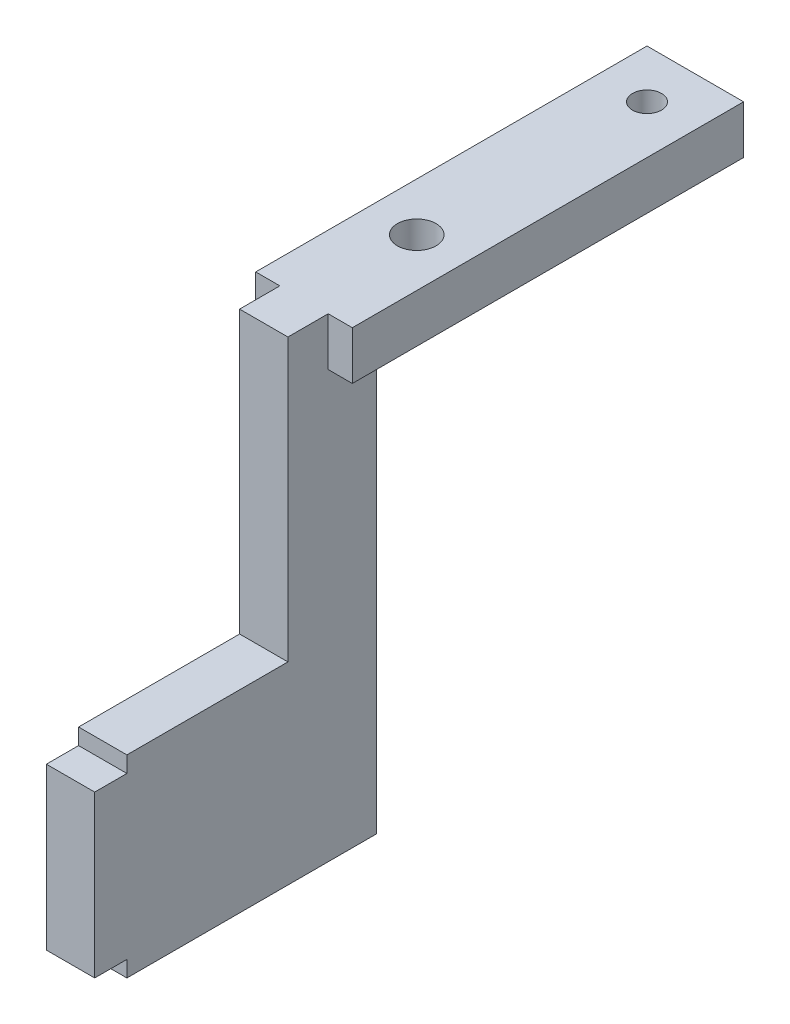
ISO-10303-21;
HEADER;
FILE_DESCRIPTION(('STEP AP214'),'2;1');
FILE_NAME('part.step','',(''),(''),'','','');
FILE_SCHEMA(('AUTOMOTIVE_DESIGN { 1 0 10303 214 1 1 1 1 }'));
ENDSEC;
DATA;
#1=APPLICATION_CONTEXT('core data for automotive mechanical design processes');
#2=APPLICATION_PROTOCOL_DEFINITION('international standard','automotive_design',2000,#1);
#3=PRODUCT_CONTEXT('',#1,'mechanical');
#4=PRODUCT('Part','Part','',(#3));
#5=PRODUCT_RELATED_PRODUCT_CATEGORY('part','',(#4));
#6=PRODUCT_DEFINITION_FORMATION('','',#4);
#7=PRODUCT_DEFINITION_CONTEXT('part definition',#1,'design');
#8=PRODUCT_DEFINITION('design','',#6,#7);
#9=PRODUCT_DEFINITION_SHAPE('','',#8);
#10=(LENGTH_UNIT() NAMED_UNIT(*) SI_UNIT(.MILLI.,.METRE.));
#11=(NAMED_UNIT(*) PLANE_ANGLE_UNIT() SI_UNIT($,.RADIAN.));
#12=(NAMED_UNIT(*) SI_UNIT($,.STERADIAN.) SOLID_ANGLE_UNIT());
#13=UNCERTAINTY_MEASURE_WITH_UNIT(LENGTH_MEASURE(1.E-05),#10,'distance_accuracy_value','');
#14=(GEOMETRIC_REPRESENTATION_CONTEXT(3) GLOBAL_UNCERTAINTY_ASSIGNED_CONTEXT((#13)) GLOBAL_UNIT_ASSIGNED_CONTEXT((#10,
#11,#12)) REPRESENTATION_CONTEXT('',''));
#15=CARTESIAN_POINT('',(0.,0.,0.));
#16=DIRECTION('',(0.,0.,1.));
#17=DIRECTION('',(1.,0.,0.));
#18=AXIS2_PLACEMENT_3D('',#15,#16,#17);
#19=CARTESIAN_POINT('',(16.3,23.475,46.));
#20=DIRECTION('',(1.,0.,0.));
#21=DIRECTION('',(0.,0.,-1.));
#22=AXIS2_PLACEMENT_3D('',#19,#20,#21);
#23=PLANE('',#22);
#24=DIRECTION('',(0.,-1.,0.));
#25=VECTOR('',#24,1.);
#26=CARTESIAN_POINT('',(16.3,23.475,44.));
#27=LINE('',#26,#25);
#28=CARTESIAN_POINT('',(16.3,-5.,44.));
#29=VERTEX_POINT('',#28);
#30=CARTESIAN_POINT('',(16.3,-6.,44.));
#31=VERTEX_POINT('',#30);
#32=EDGE_CURVE('E53',#29,#31,#27,.T.);
#33=ORIENTED_EDGE('',*,*,#32,.F.);
#34=DIRECTION('',(0.,0.,-1.));
#35=VECTOR('',#34,1.);
#36=CARTESIAN_POINT('',(16.3,-5.,46.));
#37=LINE('',#36,#35);
#38=CARTESIAN_POINT('',(16.3,-5.,46.));
#39=VERTEX_POINT('',#38);
#40=EDGE_CURVE('E183',#39,#29,#37,.T.);
#41=ORIENTED_EDGE('',*,*,#40,.F.);
#42=DIRECTION('',(0.,-1.,0.));
#43=VECTOR('',#42,1.);
#44=CARTESIAN_POINT('',(16.3,23.475,46.));
#45=LINE('',#44,#43);
#46=CARTESIAN_POINT('',(16.3,5.,46.));
#47=VERTEX_POINT('',#46);
#48=EDGE_CURVE('E208',#47,#39,#45,.T.);
#49=ORIENTED_EDGE('',*,*,#48,.F.);
#50=DIRECTION('',(0.,0.,1.));
#51=VECTOR('',#50,1.);
#52=CARTESIAN_POINT('',(16.3,5.,46.));
#53=LINE('',#52,#51);
#54=CARTESIAN_POINT('',(16.3,5.,44.));
#55=VERTEX_POINT('',#54);
#56=EDGE_CURVE('E162',#55,#47,#53,.T.);
#57=ORIENTED_EDGE('',*,*,#56,.F.);
#58=DIRECTION('',(0.,-1.,0.));
#59=VECTOR('',#58,1.);
#60=CARTESIAN_POINT('',(16.3,23.475,44.));
#61=LINE('',#60,#59);
#62=CARTESIAN_POINT('',(16.3,6.,44.));
#63=VERTEX_POINT('',#62);
#64=EDGE_CURVE('E168',#63,#55,#61,.T.);
#65=ORIENTED_EDGE('',*,*,#64,.F.);
#66=DIRECTION('',(0.,0.,1.));
#67=VECTOR('',#66,1.);
#68=CARTESIAN_POINT('',(16.3,6.,46.));
#69=LINE('',#68,#67);
#70=CARTESIAN_POINT('',(16.3,6.,34.));
#71=VERTEX_POINT('',#70);
#72=EDGE_CURVE('E188',#71,#63,#69,.T.);
#73=ORIENTED_EDGE('',*,*,#72,.F.);
#74=DIRECTION('',(0.,-1.,0.));
#75=VECTOR('',#74,1.);
#76=CARTESIAN_POINT('',(16.3,23.475,34.));
#77=LINE('',#76,#75);
#78=CARTESIAN_POINT('',(16.3,23.475,34.));
#79=VERTEX_POINT('',#78);
#80=EDGE_CURVE('E195',#79,#71,#77,.T.);
#81=ORIENTED_EDGE('',*,*,#80,.F.);
#82=DIRECTION('',(0.,0.,-1.));
#83=VECTOR('',#82,1.);
#84=CARTESIAN_POINT('',(16.3,23.475,46.));
#85=LINE('',#84,#83);
#86=CARTESIAN_POINT('',(16.3,23.475,31.5));
#87=VERTEX_POINT('',#86);
#88=EDGE_CURVE('E217',#79,#87,#85,.T.);
#89=ORIENTED_EDGE('',*,*,#88,.T.);
#90=DIRECTION('',(0.,1.,0.));
#91=VECTOR('',#90,1.);
#92=CARTESIAN_POINT('',(16.3,0.,31.5));
#93=LINE('',#92,#91);
#94=CARTESIAN_POINT('',(16.3,20.475,31.5));
#95=VERTEX_POINT('',#94);
#96=EDGE_CURVE('E274',#95,#87,#93,.T.);
#97=ORIENTED_EDGE('',*,*,#96,.F.);
#98=DIRECTION('',(0.,0.,-1.));
#99=VECTOR('',#98,1.);
#100=CARTESIAN_POINT('',(16.3,20.475,31.5));
#101=LINE('',#100,#99);
#102=CARTESIAN_POINT('',(16.3,20.475,28.5));
#103=VERTEX_POINT('',#102);
#104=EDGE_CURVE('E231',#95,#103,#101,.T.);
#105=ORIENTED_EDGE('',*,*,#104,.T.);
#106=DIRECTION('',(0.,-1.,0.));
#107=VECTOR('',#106,1.);
#108=CARTESIAN_POINT('',(16.3,23.475,28.5));
#109=LINE('',#108,#107);
#110=CARTESIAN_POINT('',(16.3,-6.,28.5));
#111=VERTEX_POINT('',#110);
#112=EDGE_CURVE('E209',#103,#111,#109,.T.);
#113=ORIENTED_EDGE('',*,*,#112,.T.);
#114=DIRECTION('',(0.,0.,-1.));
#115=VECTOR('',#114,1.);
#116=CARTESIAN_POINT('',(16.3,-6.,46.));
#117=LINE('',#116,#115);
#118=EDGE_CURVE('E230',#31,#111,#117,.T.);
#119=ORIENTED_EDGE('',*,*,#118,.F.);
#120=EDGE_LOOP('',(#33,#41,#49,#57,#65,#73,#81,#89,#97,#105,#113,#119));
#121=FACE_BOUND('',#120,.T.);
#122=ADVANCED_FACE('F39',(#121),#23,.F.);
#123=CARTESIAN_POINT('',(19.3,-6.,46.));
#124=DIRECTION('',(-1.,0.,0.));
#125=DIRECTION('',(0.,0.,1.));
#126=AXIS2_PLACEMENT_3D('',#123,#124,#125);
#127=PLANE('',#126);
#128=DIRECTION('',(0.,1.,0.));
#129=VECTOR('',#128,1.);
#130=CARTESIAN_POINT('',(19.3,-6.,44.));
#131=LINE('',#130,#129);
#132=CARTESIAN_POINT('',(19.3,-6.,44.));
#133=VERTEX_POINT('',#132);
#134=CARTESIAN_POINT('',(19.3,-5.,44.));
#135=VERTEX_POINT('',#134);
#136=EDGE_CURVE('E174',#133,#135,#131,.T.);
#137=ORIENTED_EDGE('',*,*,#136,.F.);
#138=DIRECTION('',(0.,0.,-1.));
#139=VECTOR('',#138,1.);
#140=CARTESIAN_POINT('',(19.3,-6.,46.));
#141=LINE('',#140,#139);
#142=CARTESIAN_POINT('',(19.3,-6.,28.5));
#143=VERTEX_POINT('',#142);
#144=EDGE_CURVE('E227',#133,#143,#141,.T.);
#145=ORIENTED_EDGE('',*,*,#144,.T.);
#146=DIRECTION('',(0.,1.,0.));
#147=VECTOR('',#146,1.);
#148=CARTESIAN_POINT('',(19.3,-6.,28.5));
#149=LINE('',#148,#147);
#150=CARTESIAN_POINT('',(19.3,20.475,28.5));
#151=VERTEX_POINT('',#150);
#152=EDGE_CURVE('E213',#143,#151,#149,.T.);
#153=ORIENTED_EDGE('',*,*,#152,.T.);
#154=DIRECTION('',(0.,0.,1.));
#155=VECTOR('',#154,1.);
#156=CARTESIAN_POINT('',(19.3,20.475,31.5));
#157=LINE('',#156,#155);
#158=CARTESIAN_POINT('',(19.3,20.475,31.5));
#159=VERTEX_POINT('',#158);
#160=EDGE_CURVE('E233',#151,#159,#157,.T.);
#161=ORIENTED_EDGE('',*,*,#160,.T.);
#162=DIRECTION('',(0.,-1.,0.));
#163=VECTOR('',#162,1.);
#164=CARTESIAN_POINT('',(19.3,0.,31.5));
#165=LINE('',#164,#163);
#166=CARTESIAN_POINT('',(19.3,23.475,31.5));
#167=VERTEX_POINT('',#166);
#168=EDGE_CURVE('E272',#167,#159,#165,.T.);
#169=ORIENTED_EDGE('',*,*,#168,.F.);
#170=DIRECTION('',(0.,0.,-1.));
#171=VECTOR('',#170,1.);
#172=CARTESIAN_POINT('',(19.3,23.475,46.));
#173=LINE('',#172,#171);
#174=CARTESIAN_POINT('',(19.3,23.475,34.));
#175=VERTEX_POINT('',#174);
#176=EDGE_CURVE('E221',#175,#167,#173,.T.);
#177=ORIENTED_EDGE('',*,*,#176,.F.);
#178=DIRECTION('',(0.,1.,0.));
#179=VECTOR('',#178,1.);
#180=CARTESIAN_POINT('',(19.3,-6.,34.));
#181=LINE('',#180,#179);
#182=CARTESIAN_POINT('',(19.3,6.,34.));
#183=VERTEX_POINT('',#182);
#184=EDGE_CURVE('E277',#183,#175,#181,.T.);
#185=ORIENTED_EDGE('',*,*,#184,.F.);
#186=DIRECTION('',(0.,0.,-1.));
#187=VECTOR('',#186,1.);
#188=CARTESIAN_POINT('',(19.3,6.,46.));
#189=LINE('',#188,#187);
#190=CARTESIAN_POINT('',(19.3,6.,44.));
#191=VERTEX_POINT('',#190);
#192=EDGE_CURVE('E173',#191,#183,#189,.T.);
#193=ORIENTED_EDGE('',*,*,#192,.F.);
#194=DIRECTION('',(0.,1.,0.));
#195=VECTOR('',#194,1.);
#196=CARTESIAN_POINT('',(19.3,-6.,44.));
#197=LINE('',#196,#195);
#198=CARTESIAN_POINT('',(19.3,5.,44.));
#199=VERTEX_POINT('',#198);
#200=EDGE_CURVE('E62',#199,#191,#197,.T.);
#201=ORIENTED_EDGE('',*,*,#200,.F.);
#202=DIRECTION('',(0.,0.,-1.));
#203=VECTOR('',#202,1.);
#204=CARTESIAN_POINT('',(19.3,5.,46.));
#205=LINE('',#204,#203);
#206=CARTESIAN_POINT('',(19.3,5.,46.));
#207=VERTEX_POINT('',#206);
#208=EDGE_CURVE('E151',#207,#199,#205,.T.);
#209=ORIENTED_EDGE('',*,*,#208,.F.);
#210=DIRECTION('',(0.,1.,0.));
#211=VECTOR('',#210,1.);
#212=CARTESIAN_POINT('',(19.3,-6.,46.));
#213=LINE('',#212,#211);
#214=CARTESIAN_POINT('',(19.3,-5.,46.));
#215=VERTEX_POINT('',#214);
#216=EDGE_CURVE('E214',#215,#207,#213,.T.);
#217=ORIENTED_EDGE('',*,*,#216,.F.);
#218=DIRECTION('',(0.,0.,1.));
#219=VECTOR('',#218,1.);
#220=CARTESIAN_POINT('',(19.3,-5.,46.));
#221=LINE('',#220,#219);
#222=EDGE_CURVE('E185',#135,#215,#221,.T.);
#223=ORIENTED_EDGE('',*,*,#222,.F.);
#224=EDGE_LOOP('',(#137,#145,#153,#161,#169,#177,#185,#193,#201,#209,#217,#223));
#225=FACE_BOUND('',#224,.T.);
#226=ADVANCED_FACE('F171',(#225),#127,.F.);
#227=CARTESIAN_POINT('',(0.,0.,46.));
#228=DIRECTION('',(0.,0.,1.));
#229=DIRECTION('',(1.,0.,0.));
#230=AXIS2_PLACEMENT_3D('',#227,#228,#229);
#231=PLANE('',#230);
#232=ORIENTED_EDGE('',*,*,#48,.T.);
#233=DIRECTION('',(1.,0.,0.));
#234=VECTOR('',#233,1.);
#235=CARTESIAN_POINT('',(0.,-5.,46.));
#236=LINE('',#235,#234);
#237=EDGE_CURVE('E11',#39,#215,#236,.T.);
#238=ORIENTED_EDGE('',*,*,#237,.T.);
#239=ORIENTED_EDGE('',*,*,#216,.T.);
#240=DIRECTION('',(-1.,0.,0.));
#241=VECTOR('',#240,1.);
#242=CARTESIAN_POINT('',(0.,5.,46.));
#243=LINE('',#242,#241);
#244=EDGE_CURVE('E50',#207,#47,#243,.T.);
#245=ORIENTED_EDGE('',*,*,#244,.T.);
#246=EDGE_LOOP('',(#232,#238,#239,#245));
#247=FACE_BOUND('',#246,.T.);
#248=ADVANCED_FACE('F281',(#247),#231,.T.);
#249=CARTESIAN_POINT('',(16.3,-6.,46.));
#250=DIRECTION('',(0.,1.,0.));
#251=DIRECTION('',(0.,0.,1.));
#252=AXIS2_PLACEMENT_3D('',#249,#250,#251);
#253=PLANE('',#252);
#254=DIRECTION('',(1.,0.,0.));
#255=VECTOR('',#254,1.);
#256=CARTESIAN_POINT('',(16.3,-6.,44.));
#257=LINE('',#256,#255);
#258=EDGE_CURVE('E282',#31,#133,#257,.T.);
#259=ORIENTED_EDGE('',*,*,#258,.F.);
#260=ORIENTED_EDGE('',*,*,#118,.T.);
#261=DIRECTION('',(1.,0.,0.));
#262=VECTOR('',#261,1.);
#263=CARTESIAN_POINT('',(16.3,-6.,28.5));
#264=LINE('',#263,#262);
#265=EDGE_CURVE('E216',#111,#143,#264,.T.);
#266=ORIENTED_EDGE('',*,*,#265,.T.);
#267=ORIENTED_EDGE('',*,*,#144,.F.);
#268=EDGE_LOOP('',(#259,#260,#266,#267));
#269=FACE_BOUND('',#268,.T.);
#270=ADVANCED_FACE('F294',(#269),#253,.F.);
#271=CARTESIAN_POINT('',(14.8,6.,47.));
#272=DIRECTION('',(0.,1.,0.));
#273=DIRECTION('',(0.,0.,1.));
#274=AXIS2_PLACEMENT_3D('',#271,#272,#273);
#275=PLANE('',#274);
#276=ORIENTED_EDGE('',*,*,#72,.T.);
#277=DIRECTION('',(1.,0.,0.));
#278=VECTOR('',#277,1.);
#279=CARTESIAN_POINT('',(14.8,6.,44.));
#280=LINE('',#279,#278);
#281=EDGE_CURVE('E278',#63,#191,#280,.T.);
#282=ORIENTED_EDGE('',*,*,#281,.T.);
#283=ORIENTED_EDGE('',*,*,#192,.T.);
#284=DIRECTION('',(-1.,0.,0.));
#285=VECTOR('',#284,1.);
#286=CARTESIAN_POINT('',(14.8,6.,34.));
#287=LINE('',#286,#285);
#288=EDGE_CURVE('E187',#183,#71,#287,.T.);
#289=ORIENTED_EDGE('',*,*,#288,.T.);
#290=EDGE_LOOP('',(#276,#282,#283,#289));
#291=FACE_BOUND('',#290,.T.);
#292=ADVANCED_FACE('F327',(#291),#275,.T.);
#293=CARTESIAN_POINT('',(20.8,23.475,31.5));
#294=DIRECTION('',(0.,-1.,0.));
#295=DIRECTION('',(0.,0.,-1.));
#296=AXIS2_PLACEMENT_3D('',#293,#294,#295);
#297=PLANE('',#296);
#298=CARTESIAN_POINT('',(17.8,23.475,10.2));
#299=DIRECTION('',(0.,1.,0.));
#300=DIRECTION('',(0.,0.,1.));
#301=AXIS2_PLACEMENT_3D('',#298,#299,#300);
#302=CIRCLE('',#301,0.900000000000001);
#303=CARTESIAN_POINT('',(17.8,23.475,11.1));
#304=VERTEX_POINT('',#303);
#305=EDGE_CURVE('E199',#304,#304,#302,.T.);
#306=ORIENTED_EDGE('',*,*,#305,.F.);
#307=EDGE_LOOP('',(#306));
#308=FACE_BOUND('',#307,.T.);
#309=CARTESIAN_POINT('',(17.8,23.475,24.5));
#310=DIRECTION('',(0.,1.,0.));
#311=DIRECTION('',(0.,0.,1.));
#312=AXIS2_PLACEMENT_3D('',#309,#310,#311);
#313=CIRCLE('',#312,1.2);
#314=CARTESIAN_POINT('',(17.8,23.475,25.7));
#315=VERTEX_POINT('',#314);
#316=EDGE_CURVE('E200',#315,#315,#313,.T.);
#317=ORIENTED_EDGE('',*,*,#316,.F.);
#318=EDGE_LOOP('',(#317));
#319=FACE_BOUND('',#318,.T.);
#320=DIRECTION('',(-1.,0.,0.));
#321=VECTOR('',#320,1.);
#322=CARTESIAN_POINT('',(20.8,23.475,34.));
#323=LINE('',#322,#321);
#324=EDGE_CURVE('E194',#175,#79,#323,.T.);
#325=ORIENTED_EDGE('',*,*,#324,.F.);
#326=ORIENTED_EDGE('',*,*,#176,.T.);
#327=DIRECTION('',(-1.,0.,0.));
#328=VECTOR('',#327,1.);
#329=CARTESIAN_POINT('',(20.8,23.475,31.5));
#330=LINE('',#329,#328);
#331=CARTESIAN_POINT('',(20.8,23.475,31.5));
#332=VERTEX_POINT('',#331);
#333=EDGE_CURVE('E248',#332,#167,#330,.T.);
#334=ORIENTED_EDGE('',*,*,#333,.F.);
#335=DIRECTION('',(0.,0.,-1.));
#336=VECTOR('',#335,1.);
#337=CARTESIAN_POINT('',(20.8,23.475,31.5));
#338=LINE('',#337,#336);
#339=CARTESIAN_POINT('',(20.8,23.475,7.2));
#340=VERTEX_POINT('',#339);
#341=EDGE_CURVE('E264',#332,#340,#338,.T.);
#342=ORIENTED_EDGE('',*,*,#341,.T.);
#343=DIRECTION('',(-1.,0.,0.));
#344=VECTOR('',#343,1.);
#345=CARTESIAN_POINT('',(20.8,23.475,7.2));
#346=LINE('',#345,#344);
#347=CARTESIAN_POINT('',(14.8,23.475,7.2));
#348=VERTEX_POINT('',#347);
#349=EDGE_CURVE('E245',#340,#348,#346,.T.);
#350=ORIENTED_EDGE('',*,*,#349,.T.);
#351=DIRECTION('',(0.,0.,-1.));
#352=VECTOR('',#351,1.);
#353=CARTESIAN_POINT('',(14.8,23.475,31.5));
#354=LINE('',#353,#352);
#355=CARTESIAN_POINT('',(14.8,23.475,31.5));
#356=VERTEX_POINT('',#355);
#357=EDGE_CURVE('E255',#356,#348,#354,.T.);
#358=ORIENTED_EDGE('',*,*,#357,.F.);
#359=EDGE_CURVE('E247',#87,#356,#330,.T.);
#360=ORIENTED_EDGE('',*,*,#359,.F.);
#361=ORIENTED_EDGE('',*,*,#88,.F.);
#362=EDGE_LOOP('',(#325,#326,#334,#342,#350,#358,#360,#361));
#363=FACE_BOUND('',#362,.T.);
#364=ADVANCED_FACE('F320',(#308,#319,#363),#297,.F.);
#365=CARTESIAN_POINT('',(14.8,20.475,31.5));
#366=DIRECTION('',(0.,1.,0.));
#367=DIRECTION('',(0.,0.,1.));
#368=AXIS2_PLACEMENT_3D('',#365,#366,#367);
#369=PLANE('',#368);
#370=CARTESIAN_POINT('',(17.8,20.475,24.5));
#371=DIRECTION('',(0.,1.,0.));
#372=DIRECTION('',(0.,0.,1.));
#373=AXIS2_PLACEMENT_3D('',#370,#371,#372);
#374=CIRCLE('',#373,1.2);
#375=CARTESIAN_POINT('',(17.8,20.475,25.7));
#376=VERTEX_POINT('',#375);
#377=EDGE_CURVE('E207',#376,#376,#374,.T.);
#378=ORIENTED_EDGE('',*,*,#377,.T.);
#379=EDGE_LOOP('',(#378));
#380=FACE_BOUND('',#379,.T.);
#381=CARTESIAN_POINT('',(17.8,20.475,10.2));
#382=DIRECTION('',(0.,1.,0.));
#383=DIRECTION('',(0.,0.,1.));
#384=AXIS2_PLACEMENT_3D('',#381,#382,#383);
#385=CIRCLE('',#384,0.900000000000001);
#386=CARTESIAN_POINT('',(17.8,20.475,11.1));
#387=VERTEX_POINT('',#386);
#388=EDGE_CURVE('E202',#387,#387,#385,.T.);
#389=ORIENTED_EDGE('',*,*,#388,.T.);
#390=EDGE_LOOP('',(#389));
#391=FACE_BOUND('',#390,.T.);
#392=ORIENTED_EDGE('',*,*,#104,.F.);
#393=DIRECTION('',(1.,0.,0.));
#394=VECTOR('',#393,1.);
#395=CARTESIAN_POINT('',(14.8,20.475,31.5));
#396=LINE('',#395,#394);
#397=CARTESIAN_POINT('',(14.8,20.475,31.5));
#398=VERTEX_POINT('',#397);
#399=EDGE_CURVE('E243',#398,#95,#396,.T.);
#400=ORIENTED_EDGE('',*,*,#399,.F.);
#401=DIRECTION('',(0.,0.,-1.));
#402=VECTOR('',#401,1.);
#403=CARTESIAN_POINT('',(14.8,20.475,31.5));
#404=LINE('',#403,#402);
#405=CARTESIAN_POINT('',(14.8,20.475,7.2));
#406=VERTEX_POINT('',#405);
#407=EDGE_CURVE('E268',#398,#406,#404,.T.);
#408=ORIENTED_EDGE('',*,*,#407,.T.);
#409=DIRECTION('',(1.,0.,0.));
#410=VECTOR('',#409,1.);
#411=CARTESIAN_POINT('',(14.8,20.475,7.2));
#412=LINE('',#411,#410);
#413=CARTESIAN_POINT('',(20.8,20.475,7.2));
#414=VERTEX_POINT('',#413);
#415=EDGE_CURVE('E253',#406,#414,#412,.T.);
#416=ORIENTED_EDGE('',*,*,#415,.T.);
#417=DIRECTION('',(0.,0.,-1.));
#418=VECTOR('',#417,1.);
#419=CARTESIAN_POINT('',(20.8,20.475,31.5));
#420=LINE('',#419,#418);
#421=CARTESIAN_POINT('',(20.8,20.475,31.5));
#422=VERTEX_POINT('',#421);
#423=EDGE_CURVE('E263',#422,#414,#420,.T.);
#424=ORIENTED_EDGE('',*,*,#423,.F.);
#425=EDGE_CURVE('E241',#159,#422,#396,.T.);
#426=ORIENTED_EDGE('',*,*,#425,.F.);
#427=ORIENTED_EDGE('',*,*,#160,.F.);
#428=DIRECTION('',(1.,0.,0.));
#429=VECTOR('',#428,1.);
#430=CARTESIAN_POINT('',(14.8,20.475,28.5));
#431=LINE('',#430,#429);
#432=EDGE_CURVE('E232',#103,#151,#431,.T.);
#433=ORIENTED_EDGE('',*,*,#432,.F.);
#434=EDGE_LOOP('',(#392,#400,#408,#416,#424,#426,#427,#433));
#435=FACE_BOUND('',#434,.T.);
#436=ADVANCED_FACE('F310',(#380,#391,#435),#369,.F.);
#437=CARTESIAN_POINT('',(0.,0.,31.5));
#438=DIRECTION('',(0.,0.,1.));
#439=DIRECTION('',(1.,0.,0.));
#440=AXIS2_PLACEMENT_3D('',#437,#438,#439);
#441=PLANE('',#440);
#442=ORIENTED_EDGE('',*,*,#399,.T.);
#443=ORIENTED_EDGE('',*,*,#96,.T.);
#444=ORIENTED_EDGE('',*,*,#359,.T.);
#445=DIRECTION('',(0.,-1.,0.));
#446=VECTOR('',#445,1.);
#447=CARTESIAN_POINT('',(14.8,23.475,31.5));
#448=LINE('',#447,#446);
#449=EDGE_CURVE('E238',#356,#398,#448,.T.);
#450=ORIENTED_EDGE('',*,*,#449,.T.);
#451=EDGE_LOOP('',(#442,#443,#444,#450));
#452=FACE_BOUND('',#451,.T.);
#453=ADVANCED_FACE('F349',(#452),#441,.T.);
#454=ORIENTED_EDGE('',*,*,#333,.T.);
#455=ORIENTED_EDGE('',*,*,#168,.T.);
#456=ORIENTED_EDGE('',*,*,#425,.T.);
#457=DIRECTION('',(0.,1.,0.));
#458=VECTOR('',#457,1.);
#459=CARTESIAN_POINT('',(20.8,20.475,31.5));
#460=LINE('',#459,#458);
#461=EDGE_CURVE('E246',#422,#332,#460,.T.);
#462=ORIENTED_EDGE('',*,*,#461,.T.);
#463=EDGE_LOOP('',(#454,#455,#456,#462));
#464=FACE_BOUND('',#463,.T.);
#465=ADVANCED_FACE('F311',(#464),#441,.T.);
#466=CARTESIAN_POINT('',(14.8,23.475,31.5));
#467=DIRECTION('',(1.,0.,0.));
#468=DIRECTION('',(0.,0.,-1.));
#469=AXIS2_PLACEMENT_3D('',#466,#467,#468);
#470=PLANE('',#469);
#471=DIRECTION('',(0.,-1.,0.));
#472=VECTOR('',#471,1.);
#473=CARTESIAN_POINT('',(14.8,23.475,7.2));
#474=LINE('',#473,#472);
#475=EDGE_CURVE('E240',#348,#406,#474,.T.);
#476=ORIENTED_EDGE('',*,*,#475,.T.);
#477=ORIENTED_EDGE('',*,*,#407,.F.);
#478=ORIENTED_EDGE('',*,*,#449,.F.);
#479=ORIENTED_EDGE('',*,*,#357,.T.);
#480=EDGE_LOOP('',(#476,#477,#478,#479));
#481=FACE_BOUND('',#480,.T.);
#482=ADVANCED_FACE('F41',(#481),#470,.F.);
#483=CARTESIAN_POINT('',(20.8,20.475,31.5));
#484=DIRECTION('',(-1.,0.,0.));
#485=DIRECTION('',(0.,0.,1.));
#486=AXIS2_PLACEMENT_3D('',#483,#484,#485);
#487=PLANE('',#486);
#488=DIRECTION('',(0.,1.,0.));
#489=VECTOR('',#488,1.);
#490=CARTESIAN_POINT('',(20.8,20.475,7.2));
#491=LINE('',#490,#489);
#492=EDGE_CURVE('E257',#414,#340,#491,.T.);
#493=ORIENTED_EDGE('',*,*,#492,.T.);
#494=ORIENTED_EDGE('',*,*,#341,.F.);
#495=ORIENTED_EDGE('',*,*,#461,.F.);
#496=ORIENTED_EDGE('',*,*,#423,.T.);
#497=EDGE_LOOP('',(#493,#494,#495,#496));
#498=FACE_BOUND('',#497,.T.);
#499=ADVANCED_FACE('F353',(#498),#487,.F.);
#500=CARTESIAN_POINT('',(0.,0.,7.2));
#501=DIRECTION('',(0.,0.,1.));
#502=DIRECTION('',(1.,0.,0.));
#503=AXIS2_PLACEMENT_3D('',#500,#501,#502);
#504=PLANE('',#503);
#505=ORIENTED_EDGE('',*,*,#475,.F.);
#506=ORIENTED_EDGE('',*,*,#349,.F.);
#507=ORIENTED_EDGE('',*,*,#492,.F.);
#508=ORIENTED_EDGE('',*,*,#415,.F.);
#509=EDGE_LOOP('',(#505,#506,#507,#508));
#510=FACE_BOUND('',#509,.T.);
#511=ADVANCED_FACE('F352',(#510),#504,.F.);
#512=CARTESIAN_POINT('',(0.,0.,28.5));
#513=DIRECTION('',(0.,0.,1.));
#514=DIRECTION('',(1.,0.,0.));
#515=AXIS2_PLACEMENT_3D('',#512,#513,#514);
#516=PLANE('',#515);
#517=ORIENTED_EDGE('',*,*,#112,.F.);
#518=ORIENTED_EDGE('',*,*,#432,.T.);
#519=ORIENTED_EDGE('',*,*,#152,.F.);
#520=ORIENTED_EDGE('',*,*,#265,.F.);
#521=EDGE_LOOP('',(#517,#518,#519,#520));
#522=FACE_BOUND('',#521,.T.);
#523=ADVANCED_FACE('F297',(#522),#516,.F.);
#524=CARTESIAN_POINT('',(17.8,-6.,10.2));
#525=DIRECTION('',(0.,1.,0.));
#526=DIRECTION('',(0.,0.,1.));
#527=AXIS2_PLACEMENT_3D('',#524,#525,#526);
#528=CYLINDRICAL_SURFACE('',#527,0.900000000000001);
#529=ORIENTED_EDGE('',*,*,#305,.T.);
#530=EDGE_LOOP('',(#529));
#531=FACE_BOUND('',#530,.T.);
#532=ORIENTED_EDGE('',*,*,#388,.F.);
#533=EDGE_LOOP('',(#532));
#534=FACE_BOUND('',#533,.T.);
#535=ADVANCED_FACE('F368',(#531,#534),#528,.F.);
#536=CARTESIAN_POINT('',(17.8,-6.,24.5));
#537=DIRECTION('',(0.,1.,0.));
#538=DIRECTION('',(0.,0.,1.));
#539=AXIS2_PLACEMENT_3D('',#536,#537,#538);
#540=CYLINDRICAL_SURFACE('',#539,1.2);
#541=ORIENTED_EDGE('',*,*,#316,.T.);
#542=EDGE_LOOP('',(#541));
#543=FACE_BOUND('',#542,.T.);
#544=ORIENTED_EDGE('',*,*,#377,.F.);
#545=EDGE_LOOP('',(#544));
#546=FACE_BOUND('',#545,.T.);
#547=ADVANCED_FACE('F367',(#543,#546),#540,.F.);
#548=CARTESIAN_POINT('',(14.8,6.,34.));
#549=DIRECTION('',(0.,0.,1.));
#550=DIRECTION('',(1.,0.,0.));
#551=AXIS2_PLACEMENT_3D('',#548,#549,#550);
#552=PLANE('',#551);
#553=ORIENTED_EDGE('',*,*,#80,.T.);
#554=ORIENTED_EDGE('',*,*,#288,.F.);
#555=ORIENTED_EDGE('',*,*,#184,.T.);
#556=ORIENTED_EDGE('',*,*,#324,.T.);
#557=EDGE_LOOP('',(#553,#554,#555,#556));
#558=FACE_BOUND('',#557,.T.);
#559=ADVANCED_FACE('F322',(#558),#552,.T.);
#560=CARTESIAN_POINT('',(14.8,5.,47.));
#561=DIRECTION('',(0.,1.,0.));
#562=DIRECTION('',(0.,0.,1.));
#563=AXIS2_PLACEMENT_3D('',#560,#561,#562);
#564=PLANE('',#563);
#565=ORIENTED_EDGE('',*,*,#56,.T.);
#566=ORIENTED_EDGE('',*,*,#244,.F.);
#567=ORIENTED_EDGE('',*,*,#208,.T.);
#568=DIRECTION('',(-1.,0.,0.));
#569=VECTOR('',#568,1.);
#570=CARTESIAN_POINT('',(14.8,5.,44.));
#571=LINE('',#570,#569);
#572=EDGE_CURVE('E157',#199,#55,#571,.T.);
#573=ORIENTED_EDGE('',*,*,#572,.T.);
#574=EDGE_LOOP('',(#565,#566,#567,#573));
#575=FACE_BOUND('',#574,.T.);
#576=ADVANCED_FACE('F153',(#575),#564,.T.);
#577=CARTESIAN_POINT('',(14.8,5.,44.));
#578=DIRECTION('',(0.,0.,1.));
#579=DIRECTION('',(1.,0.,0.));
#580=AXIS2_PLACEMENT_3D('',#577,#578,#579);
#581=PLANE('',#580);
#582=ORIENTED_EDGE('',*,*,#64,.T.);
#583=ORIENTED_EDGE('',*,*,#572,.F.);
#584=ORIENTED_EDGE('',*,*,#200,.T.);
#585=ORIENTED_EDGE('',*,*,#281,.F.);
#586=EDGE_LOOP('',(#582,#583,#584,#585));
#587=FACE_BOUND('',#586,.T.);
#588=ADVANCED_FACE('F165',(#587),#581,.T.);
#589=CARTESIAN_POINT('',(14.8,-5.,44.));
#590=DIRECTION('',(0.,-1.,0.));
#591=DIRECTION('',(0.,0.,-1.));
#592=AXIS2_PLACEMENT_3D('',#589,#590,#591);
#593=PLANE('',#592);
#594=ORIENTED_EDGE('',*,*,#40,.T.);
#595=DIRECTION('',(-1.,0.,0.));
#596=VECTOR('',#595,1.);
#597=CARTESIAN_POINT('',(14.8,-5.,44.));
#598=LINE('',#597,#596);
#599=EDGE_CURVE('E170',#135,#29,#598,.T.);
#600=ORIENTED_EDGE('',*,*,#599,.F.);
#601=ORIENTED_EDGE('',*,*,#222,.T.);
#602=ORIENTED_EDGE('',*,*,#237,.F.);
#603=EDGE_LOOP('',(#594,#600,#601,#602));
#604=FACE_BOUND('',#603,.T.);
#605=ADVANCED_FACE('F286',(#604),#593,.T.);
#606=CARTESIAN_POINT('',(14.8,-7.5,44.));
#607=DIRECTION('',(0.,0.,1.));
#608=DIRECTION('',(1.,0.,0.));
#609=AXIS2_PLACEMENT_3D('',#606,#607,#608);
#610=PLANE('',#609);
#611=ORIENTED_EDGE('',*,*,#32,.T.);
#612=ORIENTED_EDGE('',*,*,#258,.T.);
#613=ORIENTED_EDGE('',*,*,#136,.T.);
#614=ORIENTED_EDGE('',*,*,#599,.T.);
#615=EDGE_LOOP('',(#611,#612,#613,#614));
#616=FACE_BOUND('',#615,.T.);
#617=ADVANCED_FACE('F292',(#616),#610,.T.);
#618=CLOSED_SHELL('',(#122,#226,#248,#270,#292,#364,#436,#453,#465,#482,#499,#511,#523,#535,
#547,#559,#576,#588,#605,#617));
#619=MANIFOLD_SOLID_BREP('B2',#618);
#620=ADVANCED_BREP_SHAPE_REPRESENTATION('',(#18,#619),#14);
#621=SHAPE_DEFINITION_REPRESENTATION(#9,#620);
ENDSEC;
END-ISO-10303-21;
